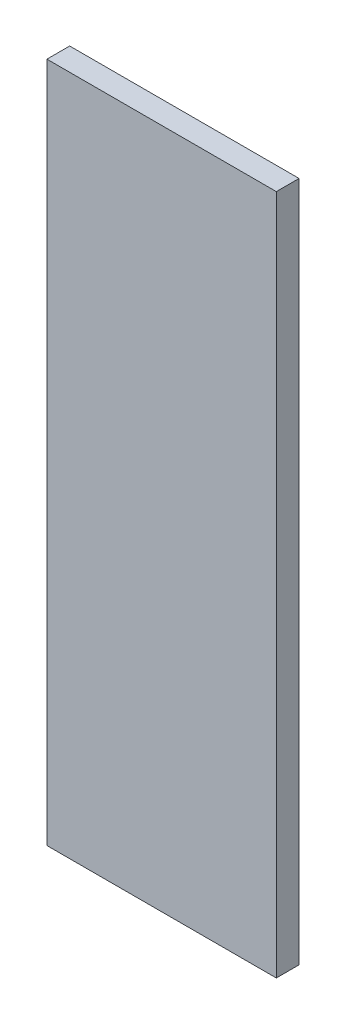
ISO-10303-21;
HEADER;
FILE_DESCRIPTION(('STEP AP214'),'2;1');
FILE_NAME('part.step','',(''),(''),'','','');
FILE_SCHEMA(('AUTOMOTIVE_DESIGN { 1 0 10303 214 1 1 1 1 }'));
ENDSEC;
DATA;
#1=APPLICATION_CONTEXT('core data for automotive mechanical design processes');
#2=APPLICATION_PROTOCOL_DEFINITION('international standard','automotive_design',2000,#1);
#3=PRODUCT_CONTEXT('',#1,'mechanical');
#4=PRODUCT('Part','Part','',(#3));
#5=PRODUCT_RELATED_PRODUCT_CATEGORY('part','',(#4));
#6=PRODUCT_DEFINITION_FORMATION('','',#4);
#7=PRODUCT_DEFINITION_CONTEXT('part definition',#1,'design');
#8=PRODUCT_DEFINITION('design','',#6,#7);
#9=PRODUCT_DEFINITION_SHAPE('','',#8);
#10=(LENGTH_UNIT() NAMED_UNIT(*) SI_UNIT(.MILLI.,.METRE.));
#11=(NAMED_UNIT(*) PLANE_ANGLE_UNIT() SI_UNIT($,.RADIAN.));
#12=(NAMED_UNIT(*) SI_UNIT($,.STERADIAN.) SOLID_ANGLE_UNIT());
#13=UNCERTAINTY_MEASURE_WITH_UNIT(LENGTH_MEASURE(1.E-05),#10,'distance_accuracy_value','');
#14=(GEOMETRIC_REPRESENTATION_CONTEXT(3) GLOBAL_UNCERTAINTY_ASSIGNED_CONTEXT((#13)) GLOBAL_UNIT_ASSIGNED_CONTEXT((#10,
#11,#12)) REPRESENTATION_CONTEXT('',''));
#15=CARTESIAN_POINT('',(0.,0.,0.));
#16=DIRECTION('',(0.,0.,1.));
#17=DIRECTION('',(1.,0.,0.));
#18=AXIS2_PLACEMENT_3D('',#15,#16,#17);
#19=CARTESIAN_POINT('',(-20.2752508361204,24.1391304347826,1.5875));
#20=DIRECTION('',(1.,0.,0.));
#21=DIRECTION('',(0.,1.,0.));
#22=AXIS2_PLACEMENT_3D('',#19,#20,#21);
#23=PLANE('',#22);
#24=DIRECTION('',(0.,-1.,0.));
#25=VECTOR('',#24,1.);
#26=CARTESIAN_POINT('',(-20.2752508361204,24.1391304347826,0.));
#27=LINE('',#26,#25);
#28=CARTESIAN_POINT('',(-20.2752508361204,24.1391304347826,0.));
#29=VERTEX_POINT('',#28);
#30=CARTESIAN_POINT('',(-20.2752508361204,-23.3608695652174,0.));
#31=VERTEX_POINT('',#30);
#32=EDGE_CURVE('E107',#29,#31,#27,.T.);
#33=ORIENTED_EDGE('',*,*,#32,.T.);
#34=DIRECTION('',(0.,0.,-1.));
#35=VECTOR('',#34,1.);
#36=CARTESIAN_POINT('',(-20.2752508361204,-23.3608695652174,1.5875));
#37=LINE('',#36,#35);
#38=CARTESIAN_POINT('',(-20.2752508361204,-23.3608695652174,1.5875));
#39=VERTEX_POINT('',#38);
#40=EDGE_CURVE('E11',#39,#31,#37,.T.);
#41=ORIENTED_EDGE('',*,*,#40,.F.);
#42=DIRECTION('',(0.,-1.,0.));
#43=VECTOR('',#42,1.);
#44=CARTESIAN_POINT('',(-20.2752508361204,24.1391304347826,1.5875));
#45=LINE('',#44,#43);
#46=CARTESIAN_POINT('',(-20.2752508361204,24.1391304347826,1.5875));
#47=VERTEX_POINT('',#46);
#48=EDGE_CURVE('E91',#47,#39,#45,.T.);
#49=ORIENTED_EDGE('',*,*,#48,.F.);
#50=DIRECTION('',(0.,0.,-1.));
#51=VECTOR('',#50,1.);
#52=CARTESIAN_POINT('',(-20.2752508361204,24.1391304347826,1.5875));
#53=LINE('',#52,#51);
#54=EDGE_CURVE('E103',#47,#29,#53,.T.);
#55=ORIENTED_EDGE('',*,*,#54,.T.);
#56=EDGE_LOOP('',(#33,#41,#49,#55));
#57=FACE_BOUND('',#56,.T.);
#58=ADVANCED_FACE('F39',(#57),#23,.F.);
#59=CARTESIAN_POINT('',(-20.2752508361204,-23.3608695652174,1.5875));
#60=DIRECTION('',(0.,1.,0.));
#61=DIRECTION('',(0.,0.,1.));
#62=AXIS2_PLACEMENT_3D('',#59,#60,#61);
#63=PLANE('',#62);
#64=DIRECTION('',(1.,0.,0.));
#65=VECTOR('',#64,1.);
#66=CARTESIAN_POINT('',(-20.2752508361204,-23.3608695652174,0.));
#67=LINE('',#66,#65);
#68=CARTESIAN_POINT('',(-4.27525083612042,-23.3608695652174,0.));
#69=VERTEX_POINT('',#68);
#70=EDGE_CURVE('E96',#31,#69,#67,.T.);
#71=ORIENTED_EDGE('',*,*,#70,.T.);
#72=DIRECTION('',(0.,0.,-1.));
#73=VECTOR('',#72,1.);
#74=CARTESIAN_POINT('',(-4.27525083612042,-23.3608695652174,1.5875));
#75=LINE('',#74,#73);
#76=CARTESIAN_POINT('',(-4.27525083612042,-23.3608695652174,1.5875));
#77=VERTEX_POINT('',#76);
#78=EDGE_CURVE('E48',#77,#69,#75,.T.);
#79=ORIENTED_EDGE('',*,*,#78,.F.);
#80=DIRECTION('',(1.,0.,0.));
#81=VECTOR('',#80,1.);
#82=CARTESIAN_POINT('',(-20.2752508361204,-23.3608695652174,1.5875));
#83=LINE('',#82,#81);
#84=EDGE_CURVE('E86',#39,#77,#83,.T.);
#85=ORIENTED_EDGE('',*,*,#84,.F.);
#86=ORIENTED_EDGE('',*,*,#40,.T.);
#87=EDGE_LOOP('',(#71,#79,#85,#86));
#88=FACE_BOUND('',#87,.T.);
#89=ADVANCED_FACE('F95',(#88),#63,.F.);
#90=CARTESIAN_POINT('',(-4.27525083612042,24.1391304347826,1.5875));
#91=DIRECTION('',(-1.,0.,0.));
#92=DIRECTION('',(0.,-1.,0.));
#93=AXIS2_PLACEMENT_3D('',#90,#91,#92);
#94=PLANE('',#93);
#95=DIRECTION('',(0.,1.,0.));
#96=VECTOR('',#95,1.);
#97=CARTESIAN_POINT('',(-4.27525083612042,24.1391304347826,0.));
#98=LINE('',#97,#96);
#99=CARTESIAN_POINT('',(-4.27525083612042,24.1391304347826,0.));
#100=VERTEX_POINT('',#99);
#101=EDGE_CURVE('E73',#69,#100,#98,.T.);
#102=ORIENTED_EDGE('',*,*,#101,.T.);
#103=DIRECTION('',(0.,0.,-1.));
#104=VECTOR('',#103,1.);
#105=CARTESIAN_POINT('',(-4.27525083612042,24.1391304347826,1.5875));
#106=LINE('',#105,#104);
#107=CARTESIAN_POINT('',(-4.27525083612042,24.1391304347826,1.5875));
#108=VERTEX_POINT('',#107);
#109=EDGE_CURVE('E98',#108,#100,#106,.T.);
#110=ORIENTED_EDGE('',*,*,#109,.F.);
#111=DIRECTION('',(0.,1.,0.));
#112=VECTOR('',#111,1.);
#113=CARTESIAN_POINT('',(-4.27525083612042,24.1391304347826,1.5875));
#114=LINE('',#113,#112);
#115=EDGE_CURVE('E89',#77,#108,#114,.T.);
#116=ORIENTED_EDGE('',*,*,#115,.F.);
#117=ORIENTED_EDGE('',*,*,#78,.T.);
#118=EDGE_LOOP('',(#102,#110,#116,#117));
#119=FACE_BOUND('',#118,.T.);
#120=ADVANCED_FACE('F99',(#119),#94,.F.);
#121=CARTESIAN_POINT('',(-20.2752508361204,24.1391304347826,1.5875));
#122=DIRECTION('',(0.,-1.,0.));
#123=DIRECTION('',(0.,0.,-1.));
#124=AXIS2_PLACEMENT_3D('',#121,#122,#123);
#125=PLANE('',#124);
#126=DIRECTION('',(-1.,0.,0.));
#127=VECTOR('',#126,1.);
#128=CARTESIAN_POINT('',(-20.2752508361204,24.1391304347826,0.));
#129=LINE('',#128,#127);
#130=EDGE_CURVE('E79',#100,#29,#129,.T.);
#131=ORIENTED_EDGE('',*,*,#130,.T.);
#132=ORIENTED_EDGE('',*,*,#54,.F.);
#133=DIRECTION('',(-1.,0.,0.));
#134=VECTOR('',#133,1.);
#135=CARTESIAN_POINT('',(-20.2752508361204,24.1391304347826,1.5875));
#136=LINE('',#135,#134);
#137=EDGE_CURVE('E56',#108,#47,#136,.T.);
#138=ORIENTED_EDGE('',*,*,#137,.F.);
#139=ORIENTED_EDGE('',*,*,#109,.T.);
#140=EDGE_LOOP('',(#131,#132,#138,#139));
#141=FACE_BOUND('',#140,.T.);
#142=ADVANCED_FACE('F120',(#141),#125,.F.);
#143=CARTESIAN_POINT('',(0.,0.,1.5875));
#144=DIRECTION('',(0.,0.,1.));
#145=DIRECTION('',(1.,0.,0.));
#146=AXIS2_PLACEMENT_3D('',#143,#144,#145);
#147=PLANE('',#146);
#148=ORIENTED_EDGE('',*,*,#48,.T.);
#149=ORIENTED_EDGE('',*,*,#84,.T.);
#150=ORIENTED_EDGE('',*,*,#115,.T.);
#151=ORIENTED_EDGE('',*,*,#137,.T.);
#152=EDGE_LOOP('',(#148,#149,#150,#151));
#153=FACE_BOUND('',#152,.T.);
#154=ADVANCED_FACE('F87',(#153),#147,.T.);
#155=CARTESIAN_POINT('',(0.,0.,0.));
#156=DIRECTION('',(0.,0.,1.));
#157=DIRECTION('',(1.,0.,0.));
#158=AXIS2_PLACEMENT_3D('',#155,#156,#157);
#159=PLANE('',#158);
#160=ORIENTED_EDGE('',*,*,#32,.F.);
#161=ORIENTED_EDGE('',*,*,#130,.F.);
#162=ORIENTED_EDGE('',*,*,#101,.F.);
#163=ORIENTED_EDGE('',*,*,#70,.F.);
#164=EDGE_LOOP('',(#160,#161,#162,#163));
#165=FACE_BOUND('',#164,.T.);
#166=ADVANCED_FACE('F123',(#165),#159,.F.);
#167=CLOSED_SHELL('',(#58,#89,#120,#142,#154,#166));
#168=MANIFOLD_SOLID_BREP('B2',#167);
#169=ADVANCED_BREP_SHAPE_REPRESENTATION('',(#18,#168),#14);
#170=SHAPE_DEFINITION_REPRESENTATION(#9,#169);
ENDSEC;
END-ISO-10303-21;
